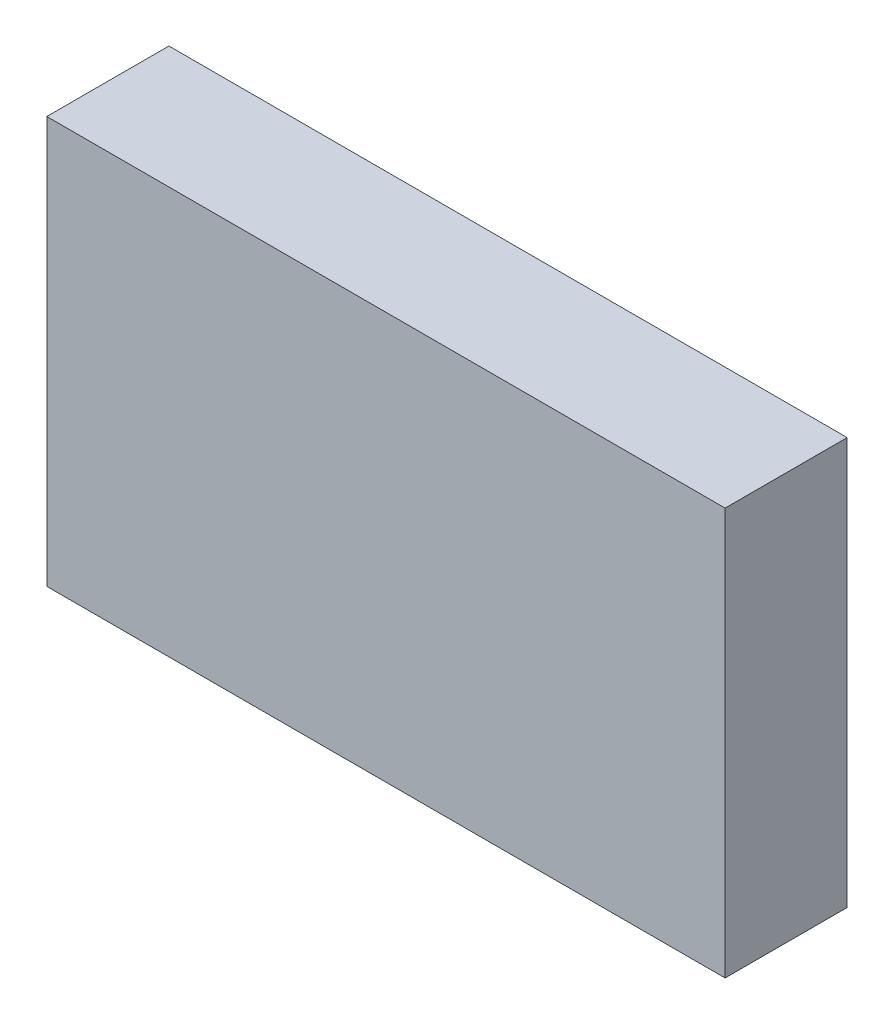
ISO-10303-21;
HEADER;
FILE_DESCRIPTION(('STEP AP214'),'2;1');
FILE_NAME('part.step','',(''),(''),'','','');
FILE_SCHEMA(('AUTOMOTIVE_DESIGN { 1 0 10303 214 1 1 1 1 }'));
ENDSEC;
DATA;
#1=APPLICATION_CONTEXT('core data for automotive mechanical design processes');
#2=APPLICATION_PROTOCOL_DEFINITION('international standard','automotive_design',2000,#1);
#3=PRODUCT_CONTEXT('',#1,'mechanical');
#4=PRODUCT('Part','Part','',(#3));
#5=PRODUCT_RELATED_PRODUCT_CATEGORY('part','',(#4));
#6=PRODUCT_DEFINITION_FORMATION('','',#4);
#7=PRODUCT_DEFINITION_CONTEXT('part definition',#1,'design');
#8=PRODUCT_DEFINITION('design','',#6,#7);
#9=PRODUCT_DEFINITION_SHAPE('','',#8);
#10=(LENGTH_UNIT() NAMED_UNIT(*) SI_UNIT(.MILLI.,.METRE.));
#11=(NAMED_UNIT(*) PLANE_ANGLE_UNIT() SI_UNIT($,.RADIAN.));
#12=(NAMED_UNIT(*) SI_UNIT($,.STERADIAN.) SOLID_ANGLE_UNIT());
#13=UNCERTAINTY_MEASURE_WITH_UNIT(LENGTH_MEASURE(1.E-05),#10,'distance_accuracy_value','');
#14=(GEOMETRIC_REPRESENTATION_CONTEXT(3) GLOBAL_UNCERTAINTY_ASSIGNED_CONTEXT((#13)) GLOBAL_UNIT_ASSIGNED_CONTEXT((#10,
#11,#12)) REPRESENTATION_CONTEXT('',''));
#15=CARTESIAN_POINT('',(0.,0.,0.));
#16=DIRECTION('',(0.,0.,1.));
#17=DIRECTION('',(1.,0.,0.));
#18=AXIS2_PLACEMENT_3D('',#15,#16,#17);
#19=CARTESIAN_POINT('',(-2.50000008,1.49999954,0.));
#20=DIRECTION('',(0.,0.,-1.));
#21=DIRECTION('',(-1.,0.,0.));
#22=AXIS2_PLACEMENT_3D('',#19,#20,#21);
#23=PLANE('',#22);
#24=DIRECTION('',(1.,0.,0.));
#25=VECTOR('',#24,1.);
#26=CARTESIAN_POINT('',(2.50000008,1.49999954,0.));
#27=LINE('',#26,#25);
#28=CARTESIAN_POINT('',(-2.50000008,1.49999954,0.));
#29=VERTEX_POINT('',#28);
#30=CARTESIAN_POINT('',(2.50000008,1.49999954,0.));
#31=VERTEX_POINT('',#30);
#32=EDGE_CURVE('E57',#29,#31,#27,.T.);
#33=ORIENTED_EDGE('',*,*,#32,.T.);
#34=DIRECTION('',(0.,1.,0.));
#35=VECTOR('',#34,1.);
#36=CARTESIAN_POINT('',(2.50000008,-1.49999954,0.));
#37=LINE('',#36,#35);
#38=CARTESIAN_POINT('',(2.50000008,-1.49999954,0.));
#39=VERTEX_POINT('',#38);
#40=EDGE_CURVE('E52',#31,#39,#37,.F.);
#41=ORIENTED_EDGE('',*,*,#40,.T.);
#42=DIRECTION('',(1.,0.,0.));
#43=VECTOR('',#42,1.);
#44=CARTESIAN_POINT('',(-2.50000008,-1.49999954,0.));
#45=LINE('',#44,#43);
#46=CARTESIAN_POINT('',(-2.50000008,-1.49999954,0.));
#47=VERTEX_POINT('',#46);
#48=EDGE_CURVE('E67',#39,#47,#45,.F.);
#49=ORIENTED_EDGE('',*,*,#48,.T.);
#50=DIRECTION('',(0.,1.,0.));
#51=VECTOR('',#50,1.);
#52=CARTESIAN_POINT('',(-2.50000008,1.49999954,0.));
#53=LINE('',#52,#51);
#54=EDGE_CURVE('E19',#47,#29,#53,.T.);
#55=ORIENTED_EDGE('',*,*,#54,.T.);
#56=EDGE_LOOP('',(#33,#41,#49,#55));
#57=FACE_BOUND('',#56,.T.);
#58=ADVANCED_FACE('F16',(#57),#23,.T.);
#59=CARTESIAN_POINT('',(-2.50000008,1.49999954,0.));
#60=DIRECTION('',(1.,0.,0.));
#61=DIRECTION('',(0.,0.,-1.));
#62=AXIS2_PLACEMENT_3D('',#59,#60,#61);
#63=PLANE('',#62);
#64=DIRECTION('',(0.,1.,0.));
#65=VECTOR('',#64,1.);
#66=CARTESIAN_POINT('',(-2.50000008,1.49999954,0.9));
#67=LINE('',#66,#65);
#68=CARTESIAN_POINT('',(-2.50000008,-1.49999954,0.9));
#69=VERTEX_POINT('',#68);
#70=CARTESIAN_POINT('',(-2.50000008,1.49999954,0.9));
#71=VERTEX_POINT('',#70);
#72=EDGE_CURVE('E73',#69,#71,#67,.T.);
#73=ORIENTED_EDGE('',*,*,#72,.T.);
#74=DIRECTION('',(0.,0.,-1.));
#75=VECTOR('',#74,1.);
#76=CARTESIAN_POINT('',(-2.50000008,1.49999954,0.));
#77=LINE('',#76,#75);
#78=EDGE_CURVE('E62',#71,#29,#77,.T.);
#79=ORIENTED_EDGE('',*,*,#78,.T.);
#80=ORIENTED_EDGE('',*,*,#54,.F.);
#81=DIRECTION('',(0.,0.,1.));
#82=VECTOR('',#81,1.);
#83=CARTESIAN_POINT('',(-2.50000008,-1.49999954,0.));
#84=LINE('',#83,#82);
#85=EDGE_CURVE('E79',#47,#69,#84,.T.);
#86=ORIENTED_EDGE('',*,*,#85,.T.);
#87=EDGE_LOOP('',(#73,#79,#80,#86));
#88=FACE_BOUND('',#87,.T.);
#89=ADVANCED_FACE('F72',(#88),#63,.F.);
#90=CARTESIAN_POINT('',(2.50000008,1.49999954,0.));
#91=DIRECTION('',(0.,-1.,0.));
#92=DIRECTION('',(0.,0.,-1.));
#93=AXIS2_PLACEMENT_3D('',#90,#91,#92);
#94=PLANE('',#93);
#95=DIRECTION('',(-1.,0.,0.));
#96=VECTOR('',#95,1.);
#97=CARTESIAN_POINT('',(-2.50000008,1.49999954,0.9));
#98=LINE('',#97,#96);
#99=CARTESIAN_POINT('',(2.50000008,1.49999954,0.9));
#100=VERTEX_POINT('',#99);
#101=EDGE_CURVE('E83',#71,#100,#98,.F.);
#102=ORIENTED_EDGE('',*,*,#101,.T.);
#103=DIRECTION('',(0.,0.,1.));
#104=VECTOR('',#103,1.);
#105=CARTESIAN_POINT('',(2.50000008,1.49999954,0.));
#106=LINE('',#105,#104);
#107=EDGE_CURVE('E64',#100,#31,#106,.F.);
#108=ORIENTED_EDGE('',*,*,#107,.T.);
#109=ORIENTED_EDGE('',*,*,#32,.F.);
#110=ORIENTED_EDGE('',*,*,#78,.F.);
#111=EDGE_LOOP('',(#102,#108,#109,#110));
#112=FACE_BOUND('',#111,.T.);
#113=ADVANCED_FACE('F60',(#112),#94,.F.);
#114=CARTESIAN_POINT('',(2.50000008,-1.49999954,0.));
#115=DIRECTION('',(-1.,0.,0.));
#116=DIRECTION('',(0.,0.,1.));
#117=AXIS2_PLACEMENT_3D('',#114,#115,#116);
#118=PLANE('',#117);
#119=DIRECTION('',(0.,1.,0.));
#120=VECTOR('',#119,1.);
#121=CARTESIAN_POINT('',(2.50000008,1.49999954,0.9));
#122=LINE('',#121,#120);
#123=CARTESIAN_POINT('',(2.50000008,-1.49999954,0.9));
#124=VERTEX_POINT('',#123);
#125=EDGE_CURVE('E25',#100,#124,#122,.F.);
#126=ORIENTED_EDGE('',*,*,#125,.T.);
#127=DIRECTION('',(0.,0.,1.));
#128=VECTOR('',#127,1.);
#129=CARTESIAN_POINT('',(2.50000008,-1.49999954,0.));
#130=LINE('',#129,#128);
#131=EDGE_CURVE('E33',#124,#39,#130,.F.);
#132=ORIENTED_EDGE('',*,*,#131,.T.);
#133=ORIENTED_EDGE('',*,*,#40,.F.);
#134=ORIENTED_EDGE('',*,*,#107,.F.);
#135=EDGE_LOOP('',(#126,#132,#133,#134));
#136=FACE_BOUND('',#135,.T.);
#137=ADVANCED_FACE('F87',(#136),#118,.F.);
#138=CARTESIAN_POINT('',(-2.50000008,-1.49999954,0.));
#139=DIRECTION('',(0.,1.,0.));
#140=DIRECTION('',(0.,0.,1.));
#141=AXIS2_PLACEMENT_3D('',#138,#139,#140);
#142=PLANE('',#141);
#143=DIRECTION('',(-1.,0.,0.));
#144=VECTOR('',#143,1.);
#145=CARTESIAN_POINT('',(-2.50000008,-1.49999954,0.9));
#146=LINE('',#145,#144);
#147=EDGE_CURVE('E11',#124,#69,#146,.T.);
#148=ORIENTED_EDGE('',*,*,#147,.T.);
#149=ORIENTED_EDGE('',*,*,#85,.F.);
#150=ORIENTED_EDGE('',*,*,#48,.F.);
#151=ORIENTED_EDGE('',*,*,#131,.F.);
#152=EDGE_LOOP('',(#148,#149,#150,#151));
#153=FACE_BOUND('',#152,.T.);
#154=ADVANCED_FACE('F90',(#153),#142,.F.);
#155=CARTESIAN_POINT('',(-2.50000008,1.49999954,0.9));
#156=DIRECTION('',(0.,0.,-1.));
#157=DIRECTION('',(-1.,0.,0.));
#158=AXIS2_PLACEMENT_3D('',#155,#156,#157);
#159=PLANE('',#158);
#160=ORIENTED_EDGE('',*,*,#125,.F.);
#161=ORIENTED_EDGE('',*,*,#101,.F.);
#162=ORIENTED_EDGE('',*,*,#72,.F.);
#163=ORIENTED_EDGE('',*,*,#147,.F.);
#164=EDGE_LOOP('',(#160,#161,#162,#163));
#165=FACE_BOUND('',#164,.T.);
#166=ADVANCED_FACE('F89',(#165),#159,.F.);
#167=CLOSED_SHELL('',(#58,#89,#113,#137,#154,#166));
#168=MANIFOLD_SOLID_BREP('B1',#167);
#169=ADVANCED_BREP_SHAPE_REPRESENTATION('',(#18,#168),#14);
#170=SHAPE_DEFINITION_REPRESENTATION(#9,#169);
ENDSEC;
END-ISO-10303-21;
